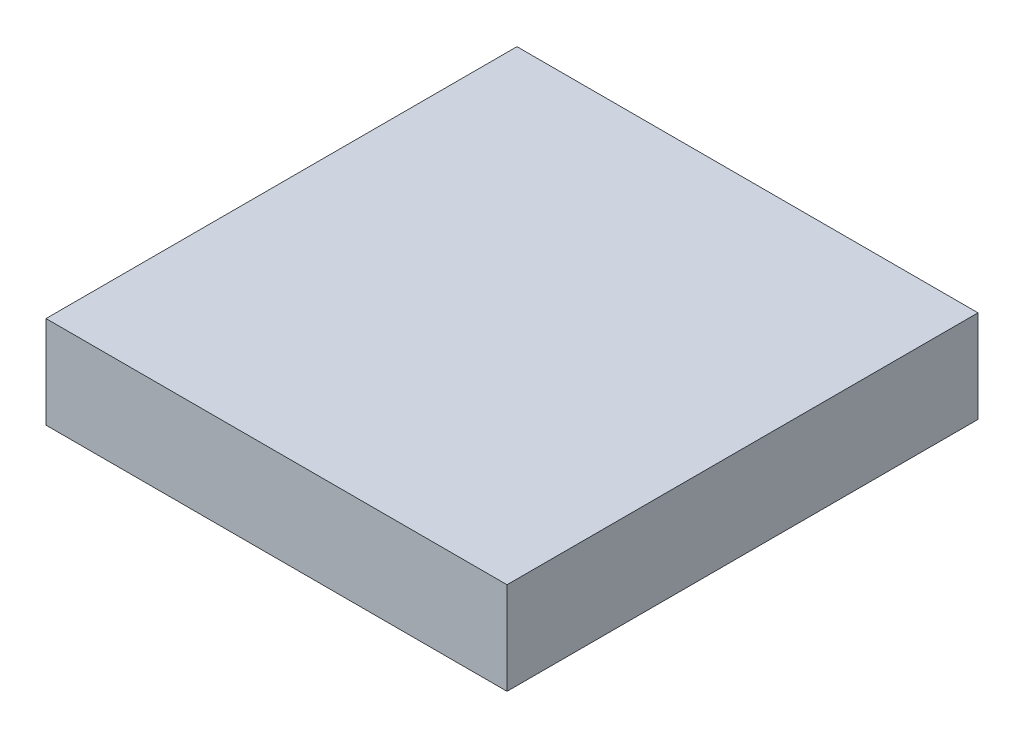
ISO-10303-21;
HEADER;
FILE_DESCRIPTION(('STEP AP214'),'2;1');
FILE_NAME('part.step','',(''),(''),'','','');
FILE_SCHEMA(('AUTOMOTIVE_DESIGN { 1 0 10303 214 1 1 1 1 }'));
ENDSEC;
DATA;
#1=APPLICATION_CONTEXT('core data for automotive mechanical design processes');
#2=APPLICATION_PROTOCOL_DEFINITION('international standard','automotive_design',2000,#1);
#3=PRODUCT_CONTEXT('',#1,'mechanical');
#4=PRODUCT('Part','Part','',(#3));
#5=PRODUCT_RELATED_PRODUCT_CATEGORY('part','',(#4));
#6=PRODUCT_DEFINITION_FORMATION('','',#4);
#7=PRODUCT_DEFINITION_CONTEXT('part definition',#1,'design');
#8=PRODUCT_DEFINITION('design','',#6,#7);
#9=PRODUCT_DEFINITION_SHAPE('','',#8);
#10=(LENGTH_UNIT() NAMED_UNIT(*) SI_UNIT(.MILLI.,.METRE.));
#11=(NAMED_UNIT(*) PLANE_ANGLE_UNIT() SI_UNIT($,.RADIAN.));
#12=(NAMED_UNIT(*) SI_UNIT($,.STERADIAN.) SOLID_ANGLE_UNIT());
#13=UNCERTAINTY_MEASURE_WITH_UNIT(LENGTH_MEASURE(1.E-05),#10,'distance_accuracy_value','');
#14=(GEOMETRIC_REPRESENTATION_CONTEXT(3) GLOBAL_UNCERTAINTY_ASSIGNED_CONTEXT((#13)) GLOBAL_UNIT_ASSIGNED_CONTEXT((#10,
#11,#12)) REPRESENTATION_CONTEXT('',''));
#15=CARTESIAN_POINT('',(0.,0.,0.));
#16=DIRECTION('',(0.,0.,1.));
#17=DIRECTION('',(1.,0.,0.));
#18=AXIS2_PLACEMENT_3D('',#15,#16,#17);
#19=CARTESIAN_POINT('',(-60.5,2.,-10.2));
#20=DIRECTION('',(1.,0.,0.));
#21=DIRECTION('',(0.,0.,-1.));
#22=AXIS2_PLACEMENT_3D('',#19,#20,#21);
#23=PLANE('',#22);
#24=DIRECTION('',(0.,0.,1.));
#25=VECTOR('',#24,1.);
#26=CARTESIAN_POINT('',(-60.5,-2.,-10.2));
#27=LINE('',#26,#25);
#28=CARTESIAN_POINT('',(-60.5,-2.,-10.2));
#29=VERTEX_POINT('',#28);
#30=CARTESIAN_POINT('',(-60.5,-2.,10.2));
#31=VERTEX_POINT('',#30);
#32=EDGE_CURVE('E96',#29,#31,#27,.T.);
#33=ORIENTED_EDGE('',*,*,#32,.T.);
#34=DIRECTION('',(0.,-1.,0.));
#35=VECTOR('',#34,1.);
#36=CARTESIAN_POINT('',(-60.5,2.,10.2));
#37=LINE('',#36,#35);
#38=CARTESIAN_POINT('',(-60.5,2.,10.2));
#39=VERTEX_POINT('',#38);
#40=EDGE_CURVE('E11',#39,#31,#37,.T.);
#41=ORIENTED_EDGE('',*,*,#40,.F.);
#42=DIRECTION('',(0.,0.,1.));
#43=VECTOR('',#42,1.);
#44=CARTESIAN_POINT('',(-60.5,2.,-10.2));
#45=LINE('',#44,#43);
#46=CARTESIAN_POINT('',(-60.5,2.,-10.2));
#47=VERTEX_POINT('',#46);
#48=EDGE_CURVE('E84',#47,#39,#45,.T.);
#49=ORIENTED_EDGE('',*,*,#48,.F.);
#50=DIRECTION('',(0.,-1.,0.));
#51=VECTOR('',#50,1.);
#52=CARTESIAN_POINT('',(-60.5,2.,-10.2));
#53=LINE('',#52,#51);
#54=EDGE_CURVE('E92',#47,#29,#53,.T.);
#55=ORIENTED_EDGE('',*,*,#54,.T.);
#56=EDGE_LOOP('',(#33,#41,#49,#55));
#57=FACE_BOUND('',#56,.T.);
#58=ADVANCED_FACE('F33',(#57),#23,.F.);
#59=CARTESIAN_POINT('',(-60.5,2.,10.2));
#60=DIRECTION('',(0.,0.,-1.));
#61=DIRECTION('',(-1.,0.,0.));
#62=AXIS2_PLACEMENT_3D('',#59,#60,#61);
#63=PLANE('',#62);
#64=DIRECTION('',(1.,0.,0.));
#65=VECTOR('',#64,1.);
#66=CARTESIAN_POINT('',(-60.5,-2.,10.2));
#67=LINE('',#66,#65);
#68=CARTESIAN_POINT('',(-40.5302118737184,-2.,10.2));
#69=VERTEX_POINT('',#68);
#70=EDGE_CURVE('E88',#31,#69,#67,.T.);
#71=ORIENTED_EDGE('',*,*,#70,.T.);
#72=DIRECTION('',(0.,-1.,0.));
#73=VECTOR('',#72,1.);
#74=CARTESIAN_POINT('',(-40.5302118737184,2.,10.2));
#75=LINE('',#74,#73);
#76=CARTESIAN_POINT('',(-40.5302118737184,2.,10.2));
#77=VERTEX_POINT('',#76);
#78=EDGE_CURVE('E41',#77,#69,#75,.T.);
#79=ORIENTED_EDGE('',*,*,#78,.F.);
#80=DIRECTION('',(1.,0.,0.));
#81=VECTOR('',#80,1.);
#82=CARTESIAN_POINT('',(-60.5,2.,10.2));
#83=LINE('',#82,#81);
#84=EDGE_CURVE('E79',#39,#77,#83,.T.);
#85=ORIENTED_EDGE('',*,*,#84,.F.);
#86=ORIENTED_EDGE('',*,*,#40,.T.);
#87=EDGE_LOOP('',(#71,#79,#85,#86));
#88=FACE_BOUND('',#87,.T.);
#89=ADVANCED_FACE('F87',(#88),#63,.F.);
#90=CARTESIAN_POINT('',(-40.5302118737184,2.,-10.2));
#91=DIRECTION('',(-1.,0.,0.));
#92=DIRECTION('',(0.,0.,1.));
#93=AXIS2_PLACEMENT_3D('',#90,#91,#92);
#94=PLANE('',#93);
#95=DIRECTION('',(0.,0.,-1.));
#96=VECTOR('',#95,1.);
#97=CARTESIAN_POINT('',(-40.5302118737184,-2.,-10.2));
#98=LINE('',#97,#96);
#99=CARTESIAN_POINT('',(-40.5302118737184,-2.,-10.2));
#100=VERTEX_POINT('',#99);
#101=EDGE_CURVE('E66',#69,#100,#98,.T.);
#102=ORIENTED_EDGE('',*,*,#101,.T.);
#103=DIRECTION('',(0.,-1.,0.));
#104=VECTOR('',#103,1.);
#105=CARTESIAN_POINT('',(-40.5302118737184,2.,-10.2));
#106=LINE('',#105,#104);
#107=CARTESIAN_POINT('',(-40.5302118737184,2.,-10.2));
#108=VERTEX_POINT('',#107);
#109=EDGE_CURVE('E89',#108,#100,#106,.T.);
#110=ORIENTED_EDGE('',*,*,#109,.F.);
#111=DIRECTION('',(0.,0.,-1.));
#112=VECTOR('',#111,1.);
#113=CARTESIAN_POINT('',(-40.5302118737184,2.,-10.2));
#114=LINE('',#113,#112);
#115=EDGE_CURVE('E82',#77,#108,#114,.T.);
#116=ORIENTED_EDGE('',*,*,#115,.F.);
#117=ORIENTED_EDGE('',*,*,#78,.T.);
#118=EDGE_LOOP('',(#102,#110,#116,#117));
#119=FACE_BOUND('',#118,.T.);
#120=ADVANCED_FACE('F90',(#119),#94,.F.);
#121=CARTESIAN_POINT('',(-60.5,2.,-10.2));
#122=DIRECTION('',(0.,0.,1.));
#123=DIRECTION('',(1.,0.,0.));
#124=AXIS2_PLACEMENT_3D('',#121,#122,#123);
#125=PLANE('',#124);
#126=DIRECTION('',(-1.,0.,0.));
#127=VECTOR('',#126,1.);
#128=CARTESIAN_POINT('',(-60.5,-2.,-10.2));
#129=LINE('',#128,#127);
#130=EDGE_CURVE('E72',#100,#29,#129,.T.);
#131=ORIENTED_EDGE('',*,*,#130,.T.);
#132=ORIENTED_EDGE('',*,*,#54,.F.);
#133=DIRECTION('',(-1.,0.,0.));
#134=VECTOR('',#133,1.);
#135=CARTESIAN_POINT('',(-60.5,2.,-10.2));
#136=LINE('',#135,#134);
#137=EDGE_CURVE('E49',#108,#47,#136,.T.);
#138=ORIENTED_EDGE('',*,*,#137,.F.);
#139=ORIENTED_EDGE('',*,*,#109,.T.);
#140=EDGE_LOOP('',(#131,#132,#138,#139));
#141=FACE_BOUND('',#140,.T.);
#142=ADVANCED_FACE('F103',(#141),#125,.F.);
#143=CARTESIAN_POINT('',(0.,2.,0.));
#144=DIRECTION('',(0.,1.,0.));
#145=DIRECTION('',(0.,0.,1.));
#146=AXIS2_PLACEMENT_3D('',#143,#144,#145);
#147=PLANE('',#146);
#148=ORIENTED_EDGE('',*,*,#48,.T.);
#149=ORIENTED_EDGE('',*,*,#84,.T.);
#150=ORIENTED_EDGE('',*,*,#115,.T.);
#151=ORIENTED_EDGE('',*,*,#137,.T.);
#152=EDGE_LOOP('',(#148,#149,#150,#151));
#153=FACE_BOUND('',#152,.T.);
#154=ADVANCED_FACE('F80',(#153),#147,.T.);
#155=CARTESIAN_POINT('',(0.,-2.,0.));
#156=DIRECTION('',(0.,1.,0.));
#157=DIRECTION('',(0.,0.,1.));
#158=AXIS2_PLACEMENT_3D('',#155,#156,#157);
#159=PLANE('',#158);
#160=ORIENTED_EDGE('',*,*,#32,.F.);
#161=ORIENTED_EDGE('',*,*,#130,.F.);
#162=ORIENTED_EDGE('',*,*,#101,.F.);
#163=ORIENTED_EDGE('',*,*,#70,.F.);
#164=EDGE_LOOP('',(#160,#161,#162,#163));
#165=FACE_BOUND('',#164,.T.);
#166=ADVANCED_FACE('F106',(#165),#159,.F.);
#167=CLOSED_SHELL('',(#58,#89,#120,#142,#154,#166));
#168=MANIFOLD_SOLID_BREP('B2',#167);
#169=ADVANCED_BREP_SHAPE_REPRESENTATION('',(#18,#168),#14);
#170=SHAPE_DEFINITION_REPRESENTATION(#9,#169);
ENDSEC;
END-ISO-10303-21;
